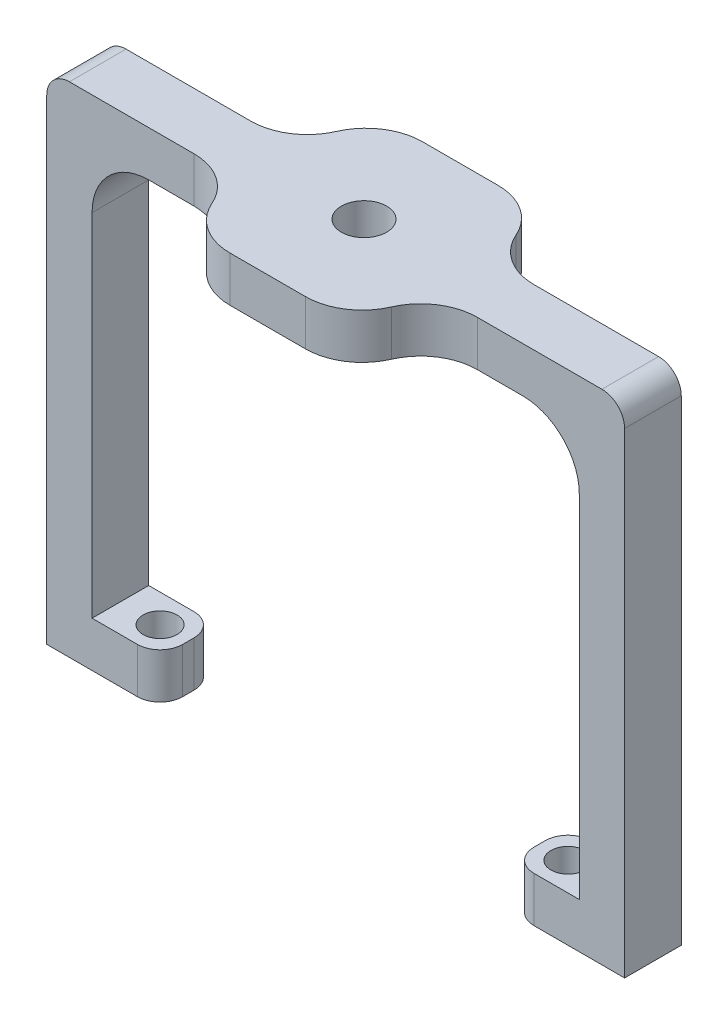
ISO-10303-21;
HEADER;
FILE_DESCRIPTION(('STEP AP214'),'2;1');
FILE_NAME('part.step','',(''),(''),'','','');
FILE_SCHEMA(('AUTOMOTIVE_DESIGN { 1 0 10303 214 1 1 1 1 }'));
ENDSEC;
DATA;
#1=APPLICATION_CONTEXT('core data for automotive mechanical design processes');
#2=APPLICATION_PROTOCOL_DEFINITION('international standard','automotive_design',2000,#1);
#3=PRODUCT_CONTEXT('',#1,'mechanical');
#4=PRODUCT('Part','Part','',(#3));
#5=PRODUCT_RELATED_PRODUCT_CATEGORY('part','',(#4));
#6=PRODUCT_DEFINITION_FORMATION('','',#4);
#7=PRODUCT_DEFINITION_CONTEXT('part definition',#1,'design');
#8=PRODUCT_DEFINITION('design','',#6,#7);
#9=PRODUCT_DEFINITION_SHAPE('','',#8);
#10=(LENGTH_UNIT() NAMED_UNIT(*) SI_UNIT(.MILLI.,.METRE.));
#11=(NAMED_UNIT(*) PLANE_ANGLE_UNIT() SI_UNIT($,.RADIAN.));
#12=(NAMED_UNIT(*) SI_UNIT($,.STERADIAN.) SOLID_ANGLE_UNIT());
#13=UNCERTAINTY_MEASURE_WITH_UNIT(LENGTH_MEASURE(1.E-05),#10,'distance_accuracy_value','');
#14=(GEOMETRIC_REPRESENTATION_CONTEXT(3) GLOBAL_UNCERTAINTY_ASSIGNED_CONTEXT((#13)) GLOBAL_UNIT_ASSIGNED_CONTEXT((#10,
#11,#12)) REPRESENTATION_CONTEXT('',''));
#15=CARTESIAN_POINT('',(0.,0.,0.));
#16=DIRECTION('',(0.,0.,1.));
#17=DIRECTION('',(1.,0.,0.));
#18=AXIS2_PLACEMENT_3D('',#15,#16,#17);
#19=CARTESIAN_POINT('',(0.,4.,5.));
#20=DIRECTION('',(0.,0.,-1.));
#21=DIRECTION('',(-1.,0.,0.));
#22=AXIS2_PLACEMENT_3D('',#19,#20,#21);
#23=PLANE('',#22);
#24=DIRECTION('',(0.,-1.,0.));
#25=VECTOR('',#24,1.);
#26=CARTESIAN_POINT('',(51.,44.,4.99999999999999));
#27=LINE('',#26,#25);
#28=CARTESIAN_POINT('',(51.,42.,4.99999999999999));
#29=VERTEX_POINT('',#28);
#30=CARTESIAN_POINT('',(51.,0.,4.99999999999999));
#31=VERTEX_POINT('',#30);
#32=EDGE_CURVE('E248',#29,#31,#27,.T.);
#33=ORIENTED_EDGE('',*,*,#32,.F.);
#34=CARTESIAN_POINT('',(49.,42.,5.));
#35=DIRECTION('',(0.,0.,-1.));
#36=DIRECTION('',(-1.,0.,0.));
#37=AXIS2_PLACEMENT_3D('',#34,#35,#36);
#38=CIRCLE('',#37,2.);
#39=CARTESIAN_POINT('',(49.,44.,5.));
#40=VERTEX_POINT('',#39);
#41=EDGE_CURVE('E443',#29,#40,#38,.F.);
#42=ORIENTED_EDGE('',*,*,#41,.T.);
#43=DIRECTION('',(1.,0.,0.));
#44=VECTOR('',#43,1.);
#45=CARTESIAN_POINT('',(0.,44.,5.));
#46=LINE('',#45,#44);
#47=CARTESIAN_POINT('',(38.,44.,5.));
#48=VERTEX_POINT('',#47);
#49=EDGE_CURVE('E291',#48,#40,#46,.T.);
#50=ORIENTED_EDGE('',*,*,#49,.F.);
#51=DIRECTION('',(0.,-1.,0.));
#52=VECTOR('',#51,1.);
#53=CARTESIAN_POINT('',(38.,4.,5.));
#54=LINE('',#53,#52);
#55=CARTESIAN_POINT('',(38.,40.,4.99999999999999));
#56=VERTEX_POINT('',#55);
#57=EDGE_CURVE('E339',#48,#56,#54,.T.);
#58=ORIENTED_EDGE('',*,*,#57,.T.);
#59=DIRECTION('',(-1.,0.,0.));
#60=VECTOR('',#59,1.);
#61=CARTESIAN_POINT('',(51.,40.,4.99999999999999));
#62=LINE('',#61,#60);
#63=CARTESIAN_POINT('',(42.,40.,4.99999999999999));
#64=VERTEX_POINT('',#63);
#65=EDGE_CURVE('E285',#64,#56,#62,.T.);
#66=ORIENTED_EDGE('',*,*,#65,.F.);
#67=CARTESIAN_POINT('',(42.,35.,5.));
#68=DIRECTION('',(0.,0.,-1.));
#69=DIRECTION('',(-1.,0.,0.));
#70=AXIS2_PLACEMENT_3D('',#67,#68,#69);
#71=CIRCLE('',#70,5.);
#72=CARTESIAN_POINT('',(47.,35.,4.99999999999999));
#73=VERTEX_POINT('',#72);
#74=EDGE_CURVE('E417',#64,#73,#71,.T.);
#75=ORIENTED_EDGE('',*,*,#74,.T.);
#76=DIRECTION('',(0.,1.,0.));
#77=VECTOR('',#76,1.);
#78=CARTESIAN_POINT('',(47.,-6.40312423743285,4.99999999999999));
#79=LINE('',#78,#77);
#80=CARTESIAN_POINT('',(47.,4.,4.99999999999999));
#81=VERTEX_POINT('',#80);
#82=EDGE_CURVE('E275',#81,#73,#79,.T.);
#83=ORIENTED_EDGE('',*,*,#82,.F.);
#84=DIRECTION('',(1.,0.,0.));
#85=VECTOR('',#84,1.);
#86=CARTESIAN_POINT('',(41.,4.,5.));
#87=LINE('',#86,#85);
#88=CARTESIAN_POINT('',(43.,4.,5.));
#89=VERTEX_POINT('',#88);
#90=EDGE_CURVE('E276',#89,#81,#87,.T.);
#91=ORIENTED_EDGE('',*,*,#90,.F.);
#92=DIRECTION('',(0.,1.,0.));
#93=VECTOR('',#92,1.);
#94=CARTESIAN_POINT('',(43.,4.,5.));
#95=LINE('',#94,#93);
#96=CARTESIAN_POINT('',(43.,0.,4.99999999999999));
#97=VERTEX_POINT('',#96);
#98=EDGE_CURVE('E250',#89,#97,#95,.F.);
#99=ORIENTED_EDGE('',*,*,#98,.T.);
#100=DIRECTION('',(1.,0.,0.));
#101=VECTOR('',#100,1.);
#102=CARTESIAN_POINT('',(51.,0.,4.99999999999999));
#103=LINE('',#102,#101);
#104=EDGE_CURVE('E246',#97,#31,#103,.T.);
#105=ORIENTED_EDGE('',*,*,#104,.T.);
#106=EDGE_LOOP('',(#33,#42,#50,#58,#66,#75,#83,#91,#99,#105));
#107=FACE_BOUND('',#106,.T.);
#108=ADVANCED_FACE('F35',(#107),#23,.F.);
#109=CARTESIAN_POINT('',(0.,4.,0.));
#110=DIRECTION('',(0.,0.,1.));
#111=DIRECTION('',(1.,0.,0.));
#112=AXIS2_PLACEMENT_3D('',#109,#110,#111);
#113=PLANE('',#112);
#114=DIRECTION('',(-1.,0.,0.));
#115=VECTOR('',#114,1.);
#116=CARTESIAN_POINT('',(0.,44.,0.));
#117=LINE('',#116,#115);
#118=CARTESIAN_POINT('',(49.,44.,0.));
#119=VERTEX_POINT('',#118);
#120=CARTESIAN_POINT('',(38.,44.,0.));
#121=VERTEX_POINT('',#120);
#122=EDGE_CURVE('E292',#119,#121,#117,.T.);
#123=ORIENTED_EDGE('',*,*,#122,.F.);
#124=CARTESIAN_POINT('',(49.,42.,0.));
#125=DIRECTION('',(0.,0.,1.));
#126=DIRECTION('',(1.,0.,0.));
#127=AXIS2_PLACEMENT_3D('',#124,#125,#126);
#128=CIRCLE('',#127,2.);
#129=CARTESIAN_POINT('',(51.,42.,0.));
#130=VERTEX_POINT('',#129);
#131=EDGE_CURVE('E452',#119,#130,#128,.F.);
#132=ORIENTED_EDGE('',*,*,#131,.T.);
#133=DIRECTION('',(0.,1.,0.));
#134=VECTOR('',#133,1.);
#135=CARTESIAN_POINT('',(51.,44.,0.));
#136=LINE('',#135,#134);
#137=CARTESIAN_POINT('',(51.,0.,0.));
#138=VERTEX_POINT('',#137);
#139=EDGE_CURVE('E264',#138,#130,#136,.T.);
#140=ORIENTED_EDGE('',*,*,#139,.F.);
#141=DIRECTION('',(-1.,0.,0.));
#142=VECTOR('',#141,1.);
#143=CARTESIAN_POINT('',(51.,0.,0.));
#144=LINE('',#143,#142);
#145=CARTESIAN_POINT('',(43.,0.,0.));
#146=VERTEX_POINT('',#145);
#147=EDGE_CURVE('E255',#138,#146,#144,.T.);
#148=ORIENTED_EDGE('',*,*,#147,.T.);
#149=DIRECTION('',(0.,-1.,0.));
#150=VECTOR('',#149,1.);
#151=CARTESIAN_POINT('',(43.,4.,0.));
#152=LINE('',#151,#150);
#153=CARTESIAN_POINT('',(43.,4.,0.));
#154=VERTEX_POINT('',#153);
#155=EDGE_CURVE('E450',#146,#154,#152,.F.);
#156=ORIENTED_EDGE('',*,*,#155,.T.);
#157=DIRECTION('',(1.,0.,0.));
#158=VECTOR('',#157,1.);
#159=CARTESIAN_POINT('',(41.,4.,0.));
#160=LINE('',#159,#158);
#161=CARTESIAN_POINT('',(47.,4.,0.));
#162=VERTEX_POINT('',#161);
#163=EDGE_CURVE('E478',#154,#162,#160,.T.);
#164=ORIENTED_EDGE('',*,*,#163,.T.);
#165=DIRECTION('',(0.,1.,0.));
#166=VECTOR('',#165,1.);
#167=CARTESIAN_POINT('',(47.,-6.40312423743285,0.));
#168=LINE('',#167,#166);
#169=CARTESIAN_POINT('',(47.,35.,0.));
#170=VERTEX_POINT('',#169);
#171=EDGE_CURVE('E272',#162,#170,#168,.T.);
#172=ORIENTED_EDGE('',*,*,#171,.T.);
#173=CARTESIAN_POINT('',(42.,35.,0.));
#174=DIRECTION('',(0.,0.,1.));
#175=DIRECTION('',(1.,0.,0.));
#176=AXIS2_PLACEMENT_3D('',#173,#174,#175);
#177=CIRCLE('',#176,5.);
#178=CARTESIAN_POINT('',(42.,40.,0.));
#179=VERTEX_POINT('',#178);
#180=EDGE_CURVE('E415',#170,#179,#177,.T.);
#181=ORIENTED_EDGE('',*,*,#180,.T.);
#182=DIRECTION('',(-1.,0.,0.));
#183=VECTOR('',#182,1.);
#184=CARTESIAN_POINT('',(51.,40.,0.));
#185=LINE('',#184,#183);
#186=CARTESIAN_POINT('',(38.,40.,0.));
#187=VERTEX_POINT('',#186);
#188=EDGE_CURVE('E282',#179,#187,#185,.T.);
#189=ORIENTED_EDGE('',*,*,#188,.T.);
#190=DIRECTION('',(0.,1.,0.));
#191=VECTOR('',#190,1.);
#192=CARTESIAN_POINT('',(38.,4.,0.));
#193=LINE('',#192,#191);
#194=EDGE_CURVE('E342',#187,#121,#193,.T.);
#195=ORIENTED_EDGE('',*,*,#194,.T.);
#196=EDGE_LOOP('',(#123,#132,#140,#148,#156,#164,#172,#181,#189,#195));
#197=FACE_BOUND('',#196,.T.);
#198=ADVANCED_FACE('F474',(#197),#113,.F.);
#199=CARTESIAN_POINT('',(47.,-6.40312423743285,4.99999999999999));
#200=DIRECTION('',(1.,0.,0.));
#201=DIRECTION('',(0.,0.,-1.));
#202=AXIS2_PLACEMENT_3D('',#199,#200,#201);
#203=PLANE('',#202);
#204=ORIENTED_EDGE('',*,*,#82,.T.);
#205=DIRECTION('',(0.,0.,-1.));
#206=VECTOR('',#205,1.);
#207=CARTESIAN_POINT('',(47.,35.,0.));
#208=LINE('',#207,#206);
#209=EDGE_CURVE('E405',#73,#170,#208,.T.);
#210=ORIENTED_EDGE('',*,*,#209,.T.);
#211=ORIENTED_EDGE('',*,*,#171,.F.);
#212=DIRECTION('',(0.,0.,-1.));
#213=VECTOR('',#212,1.);
#214=CARTESIAN_POINT('',(47.,4.,0.));
#215=LINE('',#214,#213);
#216=EDGE_CURVE('E335',#81,#162,#215,.T.);
#217=ORIENTED_EDGE('',*,*,#216,.F.);
#218=EDGE_LOOP('',(#204,#210,#211,#217));
#219=FACE_BOUND('',#218,.T.);
#220=ADVANCED_FACE('F490',(#219),#203,.F.);
#221=CARTESIAN_POINT('',(51.,40.,4.99999999999999));
#222=DIRECTION('',(0.,1.,0.));
#223=DIRECTION('',(0.,0.,1.));
#224=AXIS2_PLACEMENT_3D('',#221,#222,#223);
#225=PLANE('',#224);
#226=CARTESIAN_POINT('',(25.5,40.,2.5));
#227=DIRECTION('',(0.,1.,0.));
#228=DIRECTION('',(0.,0.,1.));
#229=AXIS2_PLACEMENT_3D('',#226,#227,#228);
#230=CIRCLE('',#229,2.);
#231=CARTESIAN_POINT('',(25.5,40.,4.5));
#232=VERTEX_POINT('',#231);
#233=EDGE_CURVE('E623',#232,#232,#230,.T.);
#234=ORIENTED_EDGE('',*,*,#233,.T.);
#235=EDGE_LOOP('',(#234));
#236=FACE_BOUND('',#235,.T.);
#237=ORIENTED_EDGE('',*,*,#188,.F.);
#238=DIRECTION('',(0.,0.,-1.));
#239=VECTOR('',#238,1.);
#240=CARTESIAN_POINT('',(42.,40.,4.99999999999999));
#241=LINE('',#240,#239);
#242=EDGE_CURVE('E411',#179,#64,#241,.F.);
#243=ORIENTED_EDGE('',*,*,#242,.T.);
#244=ORIENTED_EDGE('',*,*,#65,.T.);
#245=CARTESIAN_POINT('',(38.,40.,10.));
#246=DIRECTION('',(0.,1.,0.));
#247=DIRECTION('',(0.,0.,1.));
#248=AXIS2_PLACEMENT_3D('',#245,#246,#247);
#249=CIRCLE('',#248,5.);
#250=CARTESIAN_POINT('',(33.4174243050442,40.,8.));
#251=VERTEX_POINT('',#250);
#252=EDGE_CURVE('E353',#56,#251,#249,.T.);
#253=ORIENTED_EDGE('',*,*,#252,.T.);
#254=CARTESIAN_POINT('',(28.8348486100883,40.,6.));
#255=DIRECTION('',(0.,1.,0.));
#256=DIRECTION('',(0.,0.,1.));
#257=AXIS2_PLACEMENT_3D('',#254,#255,#256);
#258=CIRCLE('',#257,5.);
#259=CARTESIAN_POINT('',(28.8348486100883,40.,11.));
#260=VERTEX_POINT('',#259);
#261=EDGE_CURVE('E387',#251,#260,#258,.F.);
#262=ORIENTED_EDGE('',*,*,#261,.T.);
#263=DIRECTION('',(-1.,0.,0.));
#264=VECTOR('',#263,1.);
#265=CARTESIAN_POINT('',(33.,40.,11.));
#266=LINE('',#265,#264);
#267=CARTESIAN_POINT('',(22.1651513899117,40.,11.));
#268=VERTEX_POINT('',#267);
#269=EDGE_CURVE('E528',#260,#268,#266,.T.);
#270=ORIENTED_EDGE('',*,*,#269,.T.);
#271=CARTESIAN_POINT('',(22.1651513899117,40.,6.));
#272=DIRECTION('',(0.,1.,0.));
#273=DIRECTION('',(0.,0.,1.));
#274=AXIS2_PLACEMENT_3D('',#271,#272,#273);
#275=CIRCLE('',#274,5.);
#276=CARTESIAN_POINT('',(17.5825756949558,40.,8.));
#277=VERTEX_POINT('',#276);
#278=EDGE_CURVE('E385',#268,#277,#275,.F.);
#279=ORIENTED_EDGE('',*,*,#278,.T.);
#280=CARTESIAN_POINT('',(13.,40.,10.));
#281=DIRECTION('',(0.,1.,0.));
#282=DIRECTION('',(0.,0.,1.));
#283=AXIS2_PLACEMENT_3D('',#280,#281,#282);
#284=CIRCLE('',#283,5.);
#285=CARTESIAN_POINT('',(13.,40.,5.));
#286=VERTEX_POINT('',#285);
#287=EDGE_CURVE('E351',#277,#286,#284,.T.);
#288=ORIENTED_EDGE('',*,*,#287,.T.);
#289=CARTESIAN_POINT('',(9.,40.,5.));
#290=VERTEX_POINT('',#289);
#291=EDGE_CURVE('E284',#286,#290,#62,.T.);
#292=ORIENTED_EDGE('',*,*,#291,.T.);
#293=DIRECTION('',(0.,0.,-1.));
#294=VECTOR('',#293,1.);
#295=CARTESIAN_POINT('',(9.,40.,0.));
#296=LINE('',#295,#294);
#297=CARTESIAN_POINT('',(9.,40.,0.));
#298=VERTEX_POINT('',#297);
#299=EDGE_CURVE('E408',#290,#298,#296,.T.);
#300=ORIENTED_EDGE('',*,*,#299,.T.);
#301=CARTESIAN_POINT('',(13.,40.,0.));
#302=VERTEX_POINT('',#301);
#303=EDGE_CURVE('E281',#302,#298,#185,.T.);
#304=ORIENTED_EDGE('',*,*,#303,.F.);
#305=CARTESIAN_POINT('',(13.,40.,-5.));
#306=DIRECTION('',(0.,1.,0.));
#307=DIRECTION('',(0.,0.,1.));
#308=AXIS2_PLACEMENT_3D('',#305,#306,#307);
#309=CIRCLE('',#308,5.);
#310=CARTESIAN_POINT('',(17.5825756949558,40.,-3.));
#311=VERTEX_POINT('',#310);
#312=EDGE_CURVE('E364',#302,#311,#309,.T.);
#313=ORIENTED_EDGE('',*,*,#312,.T.);
#314=CARTESIAN_POINT('',(22.1651513899117,40.,-1.));
#315=DIRECTION('',(0.,1.,0.));
#316=DIRECTION('',(0.,0.,1.));
#317=AXIS2_PLACEMENT_3D('',#314,#315,#316);
#318=CIRCLE('',#317,5.);
#319=CARTESIAN_POINT('',(22.1651513899117,40.,-6.));
#320=VERTEX_POINT('',#319);
#321=EDGE_CURVE('E391',#311,#320,#318,.F.);
#322=ORIENTED_EDGE('',*,*,#321,.T.);
#323=DIRECTION('',(-1.,0.,0.));
#324=VECTOR('',#323,1.);
#325=CARTESIAN_POINT('',(33.,40.,-6.));
#326=LINE('',#325,#324);
#327=CARTESIAN_POINT('',(28.8348486100883,40.,-6.));
#328=VERTEX_POINT('',#327);
#329=EDGE_CURVE('E539',#328,#320,#326,.T.);
#330=ORIENTED_EDGE('',*,*,#329,.F.);
#331=CARTESIAN_POINT('',(28.8348486100883,40.,-1.));
#332=DIRECTION('',(0.,1.,0.));
#333=DIRECTION('',(0.,0.,1.));
#334=AXIS2_PLACEMENT_3D('',#331,#332,#333);
#335=CIRCLE('',#334,5.);
#336=CARTESIAN_POINT('',(33.4174243050442,40.,-3.));
#337=VERTEX_POINT('',#336);
#338=EDGE_CURVE('E389',#328,#337,#335,.F.);
#339=ORIENTED_EDGE('',*,*,#338,.T.);
#340=CARTESIAN_POINT('',(38.,40.,-5.));
#341=DIRECTION('',(0.,1.,0.));
#342=DIRECTION('',(0.,0.,1.));
#343=AXIS2_PLACEMENT_3D('',#340,#341,#342);
#344=CIRCLE('',#343,5.);
#345=EDGE_CURVE('E361',#337,#187,#344,.T.);
#346=ORIENTED_EDGE('',*,*,#345,.T.);
#347=EDGE_LOOP('',(#237,#243,#244,#253,#262,#270,#279,#288,#292,#300,#304,#313,#322,#330,#339,#346));
#348=FACE_BOUND('',#347,.T.);
#349=ADVANCED_FACE('F499',(#236,#348),#225,.F.);
#350=CARTESIAN_POINT('',(4.,44.,0.));
#351=DIRECTION('',(-1.,0.,0.));
#352=DIRECTION('',(0.,0.,1.));
#353=AXIS2_PLACEMENT_3D('',#350,#351,#352);
#354=PLANE('',#353);
#355=DIRECTION('',(0.,-1.,0.));
#356=VECTOR('',#355,1.);
#357=CARTESIAN_POINT('',(4.,44.,0.));
#358=LINE('',#357,#356);
#359=CARTESIAN_POINT('',(4.,35.,0.));
#360=VERTEX_POINT('',#359);
#361=CARTESIAN_POINT('',(4.,4.,0.));
#362=VERTEX_POINT('',#361);
#363=EDGE_CURVE('E294',#360,#362,#358,.T.);
#364=ORIENTED_EDGE('',*,*,#363,.F.);
#365=DIRECTION('',(0.,0.,-1.));
#366=VECTOR('',#365,1.);
#367=CARTESIAN_POINT('',(4.,35.,5.));
#368=LINE('',#367,#366);
#369=CARTESIAN_POINT('',(4.,35.,5.));
#370=VERTEX_POINT('',#369);
#371=EDGE_CURVE('E413',#360,#370,#368,.F.);
#372=ORIENTED_EDGE('',*,*,#371,.T.);
#373=DIRECTION('',(0.,-1.,0.));
#374=VECTOR('',#373,1.);
#375=CARTESIAN_POINT('',(4.,44.,5.));
#376=LINE('',#375,#374);
#377=CARTESIAN_POINT('',(4.,4.,5.));
#378=VERTEX_POINT('',#377);
#379=EDGE_CURVE('E299',#370,#378,#376,.T.);
#380=ORIENTED_EDGE('',*,*,#379,.T.);
#381=DIRECTION('',(0.,0.,-1.));
#382=VECTOR('',#381,1.);
#383=CARTESIAN_POINT('',(4.,4.,0.));
#384=LINE('',#383,#382);
#385=EDGE_CURVE('E287',#378,#362,#384,.T.);
#386=ORIENTED_EDGE('',*,*,#385,.T.);
#387=EDGE_LOOP('',(#364,#372,#380,#386));
#388=FACE_BOUND('',#387,.T.);
#389=ADVANCED_FACE('F577',(#388),#354,.F.);
#390=CARTESIAN_POINT('',(0.,4.,0.));
#391=DIRECTION('',(1.,0.,0.));
#392=DIRECTION('',(0.,0.,-1.));
#393=AXIS2_PLACEMENT_3D('',#390,#391,#392);
#394=PLANE('',#393);
#395=DIRECTION('',(0.,-1.,0.));
#396=VECTOR('',#395,1.);
#397=CARTESIAN_POINT('',(0.,4.,5.));
#398=LINE('',#397,#396);
#399=CARTESIAN_POINT('',(0.,42.,5.));
#400=VERTEX_POINT('',#399);
#401=CARTESIAN_POINT('',(0.,0.,5.));
#402=VERTEX_POINT('',#401);
#403=EDGE_CURVE('E329',#400,#402,#398,.T.);
#404=ORIENTED_EDGE('',*,*,#403,.F.);
#405=DIRECTION('',(0.,0.,1.));
#406=VECTOR('',#405,1.);
#407=CARTESIAN_POINT('',(0.,42.,0.));
#408=LINE('',#407,#406);
#409=CARTESIAN_POINT('',(0.,42.,0.));
#410=VERTEX_POINT('',#409);
#411=EDGE_CURVE('E456',#400,#410,#408,.F.);
#412=ORIENTED_EDGE('',*,*,#411,.T.);
#413=DIRECTION('',(0.,-1.,0.));
#414=VECTOR('',#413,1.);
#415=CARTESIAN_POINT('',(0.,4.,0.));
#416=LINE('',#415,#414);
#417=CARTESIAN_POINT('',(0.,0.,0.));
#418=VERTEX_POINT('',#417);
#419=EDGE_CURVE('E317',#410,#418,#416,.T.);
#420=ORIENTED_EDGE('',*,*,#419,.T.);
#421=DIRECTION('',(0.,0.,1.));
#422=VECTOR('',#421,1.);
#423=CARTESIAN_POINT('',(0.,0.,0.));
#424=LINE('',#423,#422);
#425=EDGE_CURVE('E305',#418,#402,#424,.T.);
#426=ORIENTED_EDGE('',*,*,#425,.T.);
#427=EDGE_LOOP('',(#404,#412,#420,#426));
#428=FACE_BOUND('',#427,.T.);
#429=ADVANCED_FACE('F570',(#428),#394,.F.);
#430=CARTESIAN_POINT('',(2.,44.,5.));
#431=VERTEX_POINT('',#430);
#432=CARTESIAN_POINT('',(13.,44.,5.));
#433=VERTEX_POINT('',#432);
#434=EDGE_CURVE('E288',#431,#433,#46,.T.);
#435=ORIENTED_EDGE('',*,*,#434,.F.);
#436=CARTESIAN_POINT('',(2.,42.,5.));
#437=DIRECTION('',(0.,0.,-1.));
#438=DIRECTION('',(-1.,0.,0.));
#439=AXIS2_PLACEMENT_3D('',#436,#437,#438);
#440=CIRCLE('',#439,2.);
#441=EDGE_CURVE('E454',#431,#400,#440,.F.);
#442=ORIENTED_EDGE('',*,*,#441,.T.);
#443=ORIENTED_EDGE('',*,*,#403,.T.);
#444=DIRECTION('',(1.,0.,0.));
#445=VECTOR('',#444,1.);
#446=CARTESIAN_POINT('',(0.,0.,5.));
#447=LINE('',#446,#445);
#448=CARTESIAN_POINT('',(8.,0.,5.));
#449=VERTEX_POINT('',#448);
#450=EDGE_CURVE('E320',#402,#449,#447,.T.);
#451=ORIENTED_EDGE('',*,*,#450,.T.);
#452=DIRECTION('',(0.,-1.,0.));
#453=VECTOR('',#452,1.);
#454=CARTESIAN_POINT('',(8.,4.,5.));
#455=LINE('',#454,#453);
#456=CARTESIAN_POINT('',(8.,4.,5.));
#457=VERTEX_POINT('',#456);
#458=EDGE_CURVE('E439',#449,#457,#455,.F.);
#459=ORIENTED_EDGE('',*,*,#458,.T.);
#460=DIRECTION('',(1.,0.,0.));
#461=VECTOR('',#460,1.);
#462=CARTESIAN_POINT('',(0.,4.,5.));
#463=LINE('',#462,#461);
#464=EDGE_CURVE('E308',#378,#457,#463,.T.);
#465=ORIENTED_EDGE('',*,*,#464,.F.);
#466=ORIENTED_EDGE('',*,*,#379,.F.);
#467=CARTESIAN_POINT('',(9.,35.,5.));
#468=DIRECTION('',(0.,0.,-1.));
#469=DIRECTION('',(-1.,0.,0.));
#470=AXIS2_PLACEMENT_3D('',#467,#468,#469);
#471=CIRCLE('',#470,5.);
#472=EDGE_CURVE('E421',#370,#290,#471,.T.);
#473=ORIENTED_EDGE('',*,*,#472,.T.);
#474=ORIENTED_EDGE('',*,*,#291,.F.);
#475=DIRECTION('',(0.,1.,0.));
#476=VECTOR('',#475,1.);
#477=CARTESIAN_POINT('',(13.,4.,5.));
#478=LINE('',#477,#476);
#479=EDGE_CURVE('E331',#286,#433,#478,.T.);
#480=ORIENTED_EDGE('',*,*,#479,.T.);
#481=EDGE_LOOP('',(#435,#442,#443,#451,#459,#465,#466,#473,#474,#480));
#482=FACE_BOUND('',#481,.T.);
#483=ADVANCED_FACE('F560',(#482),#23,.F.);
#484=CARTESIAN_POINT('',(10.,4.,0.));
#485=DIRECTION('',(-1.,0.,0.));
#486=DIRECTION('',(0.,0.,1.));
#487=AXIS2_PLACEMENT_3D('',#484,#485,#486);
#488=PLANE('',#487);
#489=DIRECTION('',(0.,0.,-1.));
#490=VECTOR('',#489,1.);
#491=CARTESIAN_POINT('',(10.,0.,0.));
#492=LINE('',#491,#490);
#493=CARTESIAN_POINT('',(10.,0.,3.));
#494=VERTEX_POINT('',#493);
#495=CARTESIAN_POINT('',(10.,0.,2.));
#496=VERTEX_POINT('',#495);
#497=EDGE_CURVE('E323',#494,#496,#492,.T.);
#498=ORIENTED_EDGE('',*,*,#497,.T.);
#499=DIRECTION('',(0.,-1.,0.));
#500=VECTOR('',#499,1.);
#501=CARTESIAN_POINT('',(10.,4.,2.));
#502=LINE('',#501,#500);
#503=CARTESIAN_POINT('',(10.,4.,2.));
#504=VERTEX_POINT('',#503);
#505=EDGE_CURVE('E433',#496,#504,#502,.F.);
#506=ORIENTED_EDGE('',*,*,#505,.T.);
#507=DIRECTION('',(0.,0.,-1.));
#508=VECTOR('',#507,1.);
#509=CARTESIAN_POINT('',(10.,4.,0.));
#510=LINE('',#509,#508);
#511=CARTESIAN_POINT('',(10.,4.,3.));
#512=VERTEX_POINT('',#511);
#513=EDGE_CURVE('E311',#512,#504,#510,.T.);
#514=ORIENTED_EDGE('',*,*,#513,.F.);
#515=DIRECTION('',(0.,-1.,0.));
#516=VECTOR('',#515,1.);
#517=CARTESIAN_POINT('',(10.,4.,3.));
#518=LINE('',#517,#516);
#519=EDGE_CURVE('E430',#512,#494,#518,.T.);
#520=ORIENTED_EDGE('',*,*,#519,.T.);
#521=EDGE_LOOP('',(#498,#506,#514,#520));
#522=FACE_BOUND('',#521,.T.);
#523=ADVANCED_FACE('F569',(#522),#488,.F.);
#524=ORIENTED_EDGE('',*,*,#419,.F.);
#525=CARTESIAN_POINT('',(2.,42.,0.));
#526=DIRECTION('',(0.,0.,1.));
#527=DIRECTION('',(1.,0.,0.));
#528=AXIS2_PLACEMENT_3D('',#525,#526,#527);
#529=CIRCLE('',#528,2.);
#530=CARTESIAN_POINT('',(2.,44.,0.));
#531=VERTEX_POINT('',#530);
#532=EDGE_CURVE('E458',#410,#531,#529,.F.);
#533=ORIENTED_EDGE('',*,*,#532,.T.);
#534=CARTESIAN_POINT('',(13.,44.,0.));
#535=VERTEX_POINT('',#534);
#536=EDGE_CURVE('E290',#535,#531,#117,.T.);
#537=ORIENTED_EDGE('',*,*,#536,.F.);
#538=DIRECTION('',(0.,-1.,0.));
#539=VECTOR('',#538,1.);
#540=CARTESIAN_POINT('',(13.,4.,0.));
#541=LINE('',#540,#539);
#542=EDGE_CURVE('E345',#535,#302,#541,.T.);
#543=ORIENTED_EDGE('',*,*,#542,.T.);
#544=ORIENTED_EDGE('',*,*,#303,.T.);
#545=CARTESIAN_POINT('',(9.,35.,0.));
#546=DIRECTION('',(0.,0.,1.));
#547=DIRECTION('',(1.,0.,0.));
#548=AXIS2_PLACEMENT_3D('',#545,#546,#547);
#549=CIRCLE('',#548,5.);
#550=EDGE_CURVE('E419',#298,#360,#549,.T.);
#551=ORIENTED_EDGE('',*,*,#550,.T.);
#552=ORIENTED_EDGE('',*,*,#363,.T.);
#553=DIRECTION('',(-1.,0.,0.));
#554=VECTOR('',#553,1.);
#555=CARTESIAN_POINT('',(0.,4.,0.));
#556=LINE('',#555,#554);
#557=CARTESIAN_POINT('',(8.,4.,0.));
#558=VERTEX_POINT('',#557);
#559=EDGE_CURVE('E315',#558,#362,#556,.T.);
#560=ORIENTED_EDGE('',*,*,#559,.F.);
#561=DIRECTION('',(0.,-1.,0.));
#562=VECTOR('',#561,1.);
#563=CARTESIAN_POINT('',(8.,4.,0.));
#564=LINE('',#563,#562);
#565=CARTESIAN_POINT('',(8.,0.,0.));
#566=VERTEX_POINT('',#565);
#567=EDGE_CURVE('E423',#558,#566,#564,.T.);
#568=ORIENTED_EDGE('',*,*,#567,.T.);
#569=DIRECTION('',(-1.,0.,0.));
#570=VECTOR('',#569,1.);
#571=CARTESIAN_POINT('',(0.,0.,0.));
#572=LINE('',#571,#570);
#573=EDGE_CURVE('E312',#566,#418,#572,.T.);
#574=ORIENTED_EDGE('',*,*,#573,.T.);
#575=EDGE_LOOP('',(#524,#533,#537,#543,#544,#551,#552,#560,#568,#574));
#576=FACE_BOUND('',#575,.T.);
#577=ADVANCED_FACE('F565',(#576),#113,.F.);
#578=CARTESIAN_POINT('',(0.,4.,0.));
#579=DIRECTION('',(0.,1.,0.));
#580=DIRECTION('',(0.,0.,1.));
#581=AXIS2_PLACEMENT_3D('',#578,#579,#580);
#582=PLANE('',#581);
#583=ORIENTED_EDGE('',*,*,#513,.T.);
#584=CARTESIAN_POINT('',(8.,4.,2.));
#585=DIRECTION('',(0.,1.,0.));
#586=DIRECTION('',(0.,0.,1.));
#587=AXIS2_PLACEMENT_3D('',#584,#585,#586);
#588=CIRCLE('',#587,2.);
#589=EDGE_CURVE('E437',#504,#558,#588,.T.);
#590=ORIENTED_EDGE('',*,*,#589,.T.);
#591=ORIENTED_EDGE('',*,*,#559,.T.);
#592=ORIENTED_EDGE('',*,*,#385,.F.);
#593=ORIENTED_EDGE('',*,*,#464,.T.);
#594=CARTESIAN_POINT('',(8.,4.,3.));
#595=DIRECTION('',(0.,1.,0.));
#596=DIRECTION('',(0.,0.,1.));
#597=AXIS2_PLACEMENT_3D('',#594,#595,#596);
#598=CIRCLE('',#597,2.);
#599=EDGE_CURVE('E435',#457,#512,#598,.T.);
#600=ORIENTED_EDGE('',*,*,#599,.T.);
#601=EDGE_LOOP('',(#583,#590,#591,#592,#593,#600));
#602=FACE_BOUND('',#601,.T.);
#603=CARTESIAN_POINT('',(7.5,4.,2.5));
#604=DIRECTION('',(0.,1.,0.));
#605=DIRECTION('',(0.,0.,1.));
#606=AXIS2_PLACEMENT_3D('',#603,#604,#605);
#607=CIRCLE('',#606,1.5);
#608=CARTESIAN_POINT('',(7.5,4.,4.));
#609=VERTEX_POINT('',#608);
#610=EDGE_CURVE('E301',#609,#609,#607,.T.);
#611=ORIENTED_EDGE('',*,*,#610,.F.);
#612=EDGE_LOOP('',(#611));
#613=FACE_BOUND('',#612,.T.);
#614=ADVANCED_FACE('F648',(#602,#613),#582,.T.);
#615=CARTESIAN_POINT('',(0.,0.,0.));
#616=DIRECTION('',(0.,1.,0.));
#617=DIRECTION('',(0.,0.,1.));
#618=AXIS2_PLACEMENT_3D('',#615,#616,#617);
#619=PLANE('',#618);
#620=CARTESIAN_POINT('',(7.5,0.,2.5));
#621=DIRECTION('',(0.,1.,0.));
#622=DIRECTION('',(0.,0.,1.));
#623=AXIS2_PLACEMENT_3D('',#620,#621,#622);
#624=CIRCLE('',#623,1.5);
#625=CARTESIAN_POINT('',(7.5,0.,4.));
#626=VERTEX_POINT('',#625);
#627=EDGE_CURVE('E302',#626,#626,#624,.T.);
#628=ORIENTED_EDGE('',*,*,#627,.T.);
#629=EDGE_LOOP('',(#628));
#630=FACE_BOUND('',#629,.T.);
#631=ORIENTED_EDGE('',*,*,#573,.F.);
#632=CARTESIAN_POINT('',(8.,0.,2.));
#633=DIRECTION('',(0.,1.,0.));
#634=DIRECTION('',(0.,0.,1.));
#635=AXIS2_PLACEMENT_3D('',#632,#633,#634);
#636=CIRCLE('',#635,2.);
#637=EDGE_CURVE('E428',#566,#496,#636,.F.);
#638=ORIENTED_EDGE('',*,*,#637,.T.);
#639=ORIENTED_EDGE('',*,*,#497,.F.);
#640=CARTESIAN_POINT('',(8.,0.,3.));
#641=DIRECTION('',(0.,1.,0.));
#642=DIRECTION('',(0.,0.,1.));
#643=AXIS2_PLACEMENT_3D('',#640,#641,#642);
#644=CIRCLE('',#643,2.);
#645=EDGE_CURVE('E426',#494,#449,#644,.F.);
#646=ORIENTED_EDGE('',*,*,#645,.T.);
#647=ORIENTED_EDGE('',*,*,#450,.F.);
#648=ORIENTED_EDGE('',*,*,#425,.F.);
#649=EDGE_LOOP('',(#631,#638,#639,#646,#647,#648));
#650=FACE_BOUND('',#649,.T.);
#651=ADVANCED_FACE('F640',(#630,#650),#619,.F.);
#652=CARTESIAN_POINT('',(7.5,0.,2.5));
#653=DIRECTION('',(0.,1.,0.));
#654=DIRECTION('',(0.,0.,1.));
#655=AXIS2_PLACEMENT_3D('',#652,#653,#654);
#656=CYLINDRICAL_SURFACE('',#655,1.5);
#657=ORIENTED_EDGE('',*,*,#627,.F.);
#658=EDGE_LOOP('',(#657));
#659=FACE_BOUND('',#658,.T.);
#660=ORIENTED_EDGE('',*,*,#610,.T.);
#661=EDGE_LOOP('',(#660));
#662=FACE_BOUND('',#661,.T.);
#663=ADVANCED_FACE('F635',(#659,#662),#656,.F.);
#664=CARTESIAN_POINT('',(0.,44.,0.));
#665=DIRECTION('',(0.,1.,0.));
#666=DIRECTION('',(0.,0.,1.));
#667=AXIS2_PLACEMENT_3D('',#664,#665,#666);
#668=PLANE('',#667);
#669=CARTESIAN_POINT('',(25.5,44.,2.5));
#670=DIRECTION('',(0.,1.,0.));
#671=DIRECTION('',(0.,0.,1.));
#672=AXIS2_PLACEMENT_3D('',#669,#670,#671);
#673=CIRCLE('',#672,2.);
#674=CARTESIAN_POINT('',(25.5,44.,4.5));
#675=VERTEX_POINT('',#674);
#676=EDGE_CURVE('E625',#675,#675,#673,.T.);
#677=ORIENTED_EDGE('',*,*,#676,.F.);
#678=EDGE_LOOP('',(#677));
#679=FACE_BOUND('',#678,.T.);
#680=ORIENTED_EDGE('',*,*,#49,.T.);
#681=DIRECTION('',(0.,0.,1.));
#682=VECTOR('',#681,1.);
#683=CARTESIAN_POINT('',(49.,44.,0.));
#684=LINE('',#683,#682);
#685=EDGE_CURVE('E448',#40,#119,#684,.F.);
#686=ORIENTED_EDGE('',*,*,#685,.T.);
#687=ORIENTED_EDGE('',*,*,#122,.T.);
#688=CARTESIAN_POINT('',(38.,44.,-5.));
#689=DIRECTION('',(0.,1.,0.));
#690=DIRECTION('',(0.,0.,1.));
#691=AXIS2_PLACEMENT_3D('',#688,#689,#690);
#692=CIRCLE('',#691,5.);
#693=CARTESIAN_POINT('',(33.4174243050442,44.,-3.));
#694=VERTEX_POINT('',#693);
#695=EDGE_CURVE('E358',#121,#694,#692,.F.);
#696=ORIENTED_EDGE('',*,*,#695,.T.);
#697=CARTESIAN_POINT('',(28.8348486100883,44.,-1.));
#698=DIRECTION('',(0.,1.,0.));
#699=DIRECTION('',(0.,0.,1.));
#700=AXIS2_PLACEMENT_3D('',#697,#698,#699);
#701=CIRCLE('',#700,5.);
#702=CARTESIAN_POINT('',(28.8348486100883,44.,-6.));
#703=VERTEX_POINT('',#702);
#704=EDGE_CURVE('E379',#694,#703,#701,.T.);
#705=ORIENTED_EDGE('',*,*,#704,.T.);
#706=DIRECTION('',(1.,0.,0.));
#707=VECTOR('',#706,1.);
#708=CARTESIAN_POINT('',(33.,44.,-6.));
#709=LINE('',#708,#707);
#710=CARTESIAN_POINT('',(22.1651513899117,44.,-6.));
#711=VERTEX_POINT('',#710);
#712=EDGE_CURVE('E535',#711,#703,#709,.T.);
#713=ORIENTED_EDGE('',*,*,#712,.F.);
#714=CARTESIAN_POINT('',(22.1651513899117,44.,-1.));
#715=DIRECTION('',(0.,1.,0.));
#716=DIRECTION('',(0.,0.,1.));
#717=AXIS2_PLACEMENT_3D('',#714,#715,#716);
#718=CIRCLE('',#717,5.);
#719=CARTESIAN_POINT('',(17.5825756949558,44.,-3.));
#720=VERTEX_POINT('',#719);
#721=EDGE_CURVE('E381',#711,#720,#718,.T.);
#722=ORIENTED_EDGE('',*,*,#721,.T.);
#723=CARTESIAN_POINT('',(13.,44.,-5.));
#724=DIRECTION('',(0.,1.,0.));
#725=DIRECTION('',(0.,0.,1.));
#726=AXIS2_PLACEMENT_3D('',#723,#724,#725);
#727=CIRCLE('',#726,5.);
#728=EDGE_CURVE('E367',#720,#535,#727,.F.);
#729=ORIENTED_EDGE('',*,*,#728,.T.);
#730=ORIENTED_EDGE('',*,*,#536,.T.);
#731=DIRECTION('',(0.,0.,1.));
#732=VECTOR('',#731,1.);
#733=CARTESIAN_POINT('',(2.,44.,5.));
#734=LINE('',#733,#732);
#735=EDGE_CURVE('E445',#531,#431,#734,.T.);
#736=ORIENTED_EDGE('',*,*,#735,.T.);
#737=ORIENTED_EDGE('',*,*,#434,.T.);
#738=CARTESIAN_POINT('',(13.,44.,10.));
#739=DIRECTION('',(0.,1.,0.));
#740=DIRECTION('',(0.,0.,1.));
#741=AXIS2_PLACEMENT_3D('',#738,#739,#740);
#742=CIRCLE('',#741,5.);
#743=CARTESIAN_POINT('',(17.5825756949558,44.,8.));
#744=VERTEX_POINT('',#743);
#745=EDGE_CURVE('E348',#433,#744,#742,.F.);
#746=ORIENTED_EDGE('',*,*,#745,.T.);
#747=CARTESIAN_POINT('',(22.1651513899117,44.,6.));
#748=DIRECTION('',(0.,1.,0.));
#749=DIRECTION('',(0.,0.,1.));
#750=AXIS2_PLACEMENT_3D('',#747,#748,#749);
#751=CIRCLE('',#750,5.);
#752=CARTESIAN_POINT('',(22.1651513899117,44.,11.));
#753=VERTEX_POINT('',#752);
#754=EDGE_CURVE('E375',#744,#753,#751,.T.);
#755=ORIENTED_EDGE('',*,*,#754,.T.);
#756=DIRECTION('',(1.,0.,0.));
#757=VECTOR('',#756,1.);
#758=CARTESIAN_POINT('',(33.,44.,11.));
#759=LINE('',#758,#757);
#760=CARTESIAN_POINT('',(28.8348486100883,44.,11.));
#761=VERTEX_POINT('',#760);
#762=EDGE_CURVE('E534',#753,#761,#759,.T.);
#763=ORIENTED_EDGE('',*,*,#762,.T.);
#764=CARTESIAN_POINT('',(28.8348486100883,44.,6.));
#765=DIRECTION('',(0.,1.,0.));
#766=DIRECTION('',(0.,0.,1.));
#767=AXIS2_PLACEMENT_3D('',#764,#765,#766);
#768=CIRCLE('',#767,5.);
#769=CARTESIAN_POINT('',(33.4174243050442,44.,8.));
#770=VERTEX_POINT('',#769);
#771=EDGE_CURVE('E377',#761,#770,#768,.T.);
#772=ORIENTED_EDGE('',*,*,#771,.T.);
#773=CARTESIAN_POINT('',(38.,44.,10.));
#774=DIRECTION('',(0.,1.,0.));
#775=DIRECTION('',(0.,0.,1.));
#776=AXIS2_PLACEMENT_3D('',#773,#774,#775);
#777=CIRCLE('',#776,5.);
#778=EDGE_CURVE('E356',#770,#48,#777,.F.);
#779=ORIENTED_EDGE('',*,*,#778,.T.);
#780=EDGE_LOOP('',(#680,#686,#687,#696,#705,#713,#722,#729,#730,#736,#737,#746,#755,#763,#772,#779));
#781=FACE_BOUND('',#780,.T.);
#782=ADVANCED_FACE('F515',(#679,#781),#668,.T.);
#783=CARTESIAN_POINT('',(51.,0.,0.));
#784=DIRECTION('',(1.,0.,0.));
#785=DIRECTION('',(0.,0.,-1.));
#786=AXIS2_PLACEMENT_3D('',#783,#784,#785);
#787=PLANE('',#786);
#788=ORIENTED_EDGE('',*,*,#139,.T.);
#789=DIRECTION('',(0.,0.,1.));
#790=VECTOR('',#789,1.);
#791=CARTESIAN_POINT('',(51.,42.,0.));
#792=LINE('',#791,#790);
#793=EDGE_CURVE('E263',#130,#29,#792,.T.);
#794=ORIENTED_EDGE('',*,*,#793,.T.);
#795=ORIENTED_EDGE('',*,*,#32,.T.);
#796=DIRECTION('',(0.,0.,-1.));
#797=VECTOR('',#796,1.);
#798=CARTESIAN_POINT('',(51.,0.,4.99999999999999));
#799=LINE('',#798,#797);
#800=EDGE_CURVE('E254',#31,#138,#799,.T.);
#801=ORIENTED_EDGE('',*,*,#800,.T.);
#802=EDGE_LOOP('',(#788,#794,#795,#801));
#803=FACE_BOUND('',#802,.T.);
#804=ADVANCED_FACE('F261',(#803),#787,.T.);
#805=CARTESIAN_POINT('',(0.,0.,0.));
#806=DIRECTION('',(0.,1.,0.));
#807=DIRECTION('',(0.,0.,1.));
#808=AXIS2_PLACEMENT_3D('',#805,#806,#807);
#809=PLANE('',#808);
#810=CARTESIAN_POINT('',(43.5,0.,2.5));
#811=DIRECTION('',(0.,-1.,0.));
#812=DIRECTION('',(0.,0.,-1.));
#813=AXIS2_PLACEMENT_3D('',#810,#811,#812);
#814=CIRCLE('',#813,1.5);
#815=CARTESIAN_POINT('',(43.5,0.,0.999999999999997));
#816=VERTEX_POINT('',#815);
#817=EDGE_CURVE('E336',#816,#816,#814,.T.);
#818=ORIENTED_EDGE('',*,*,#817,.F.);
#819=EDGE_LOOP('',(#818));
#820=FACE_BOUND('',#819,.T.);
#821=ORIENTED_EDGE('',*,*,#104,.F.);
#822=CARTESIAN_POINT('',(43.,0.,3.));
#823=DIRECTION('',(0.,1.,0.));
#824=DIRECTION('',(0.,0.,1.));
#825=AXIS2_PLACEMENT_3D('',#822,#823,#824);
#826=CIRCLE('',#825,2.);
#827=CARTESIAN_POINT('',(41.,0.,3.));
#828=VERTEX_POINT('',#827);
#829=EDGE_CURVE('E11',#97,#828,#826,.F.);
#830=ORIENTED_EDGE('',*,*,#829,.T.);
#831=DIRECTION('',(0.,0.,1.));
#832=VECTOR('',#831,1.);
#833=CARTESIAN_POINT('',(41.,0.,0.));
#834=LINE('',#833,#832);
#835=CARTESIAN_POINT('',(41.,0.,2.));
#836=VERTEX_POINT('',#835);
#837=EDGE_CURVE('E468',#836,#828,#834,.T.);
#838=ORIENTED_EDGE('',*,*,#837,.F.);
#839=CARTESIAN_POINT('',(43.,0.,2.));
#840=DIRECTION('',(0.,1.,0.));
#841=DIRECTION('',(0.,0.,1.));
#842=AXIS2_PLACEMENT_3D('',#839,#840,#841);
#843=CIRCLE('',#842,2.);
#844=EDGE_CURVE('E43',#836,#146,#843,.F.);
#845=ORIENTED_EDGE('',*,*,#844,.T.);
#846=ORIENTED_EDGE('',*,*,#147,.F.);
#847=ORIENTED_EDGE('',*,*,#800,.F.);
#848=EDGE_LOOP('',(#821,#830,#838,#845,#846,#847));
#849=FACE_BOUND('',#848,.T.);
#850=ADVANCED_FACE('F267',(#820,#849),#809,.F.);
#851=CARTESIAN_POINT('',(41.,4.,0.));
#852=DIRECTION('',(0.,-1.,0.));
#853=DIRECTION('',(0.,0.,-1.));
#854=AXIS2_PLACEMENT_3D('',#851,#852,#853);
#855=PLANE('',#854);
#856=CARTESIAN_POINT('',(43.5,4.,2.5));
#857=DIRECTION('',(0.,-1.,0.));
#858=DIRECTION('',(0.,0.,-1.));
#859=AXIS2_PLACEMENT_3D('',#856,#857,#858);
#860=CIRCLE('',#859,1.5);
#861=CARTESIAN_POINT('',(43.5,4.,0.999999999999997));
#862=VERTEX_POINT('',#861);
#863=EDGE_CURVE('E332',#862,#862,#860,.T.);
#864=ORIENTED_EDGE('',*,*,#863,.T.);
#865=EDGE_LOOP('',(#864));
#866=FACE_BOUND('',#865,.T.);
#867=DIRECTION('',(0.,0.,-1.));
#868=VECTOR('',#867,1.);
#869=CARTESIAN_POINT('',(41.,4.,0.));
#870=LINE('',#869,#868);
#871=CARTESIAN_POINT('',(41.,4.,3.));
#872=VERTEX_POINT('',#871);
#873=CARTESIAN_POINT('',(41.,4.,2.));
#874=VERTEX_POINT('',#873);
#875=EDGE_CURVE('E477',#872,#874,#870,.T.);
#876=ORIENTED_EDGE('',*,*,#875,.F.);
#877=CARTESIAN_POINT('',(43.,4.,3.));
#878=DIRECTION('',(0.,-1.,0.));
#879=DIRECTION('',(0.,0.,-1.));
#880=AXIS2_PLACEMENT_3D('',#877,#878,#879);
#881=CIRCLE('',#880,2.);
#882=EDGE_CURVE('E58',#872,#89,#881,.F.);
#883=ORIENTED_EDGE('',*,*,#882,.T.);
#884=ORIENTED_EDGE('',*,*,#90,.T.);
#885=ORIENTED_EDGE('',*,*,#216,.T.);
#886=ORIENTED_EDGE('',*,*,#163,.F.);
#887=CARTESIAN_POINT('',(43.,4.,2.));
#888=DIRECTION('',(0.,-1.,0.));
#889=DIRECTION('',(0.,0.,-1.));
#890=AXIS2_PLACEMENT_3D('',#887,#888,#889);
#891=CIRCLE('',#890,2.);
#892=EDGE_CURVE('E50',#154,#874,#891,.F.);
#893=ORIENTED_EDGE('',*,*,#892,.T.);
#894=EDGE_LOOP('',(#876,#883,#884,#885,#886,#893));
#895=FACE_BOUND('',#894,.T.);
#896=ADVANCED_FACE('F486',(#866,#895),#855,.F.);
#897=CARTESIAN_POINT('',(41.,0.,0.));
#898=DIRECTION('',(1.,0.,0.));
#899=DIRECTION('',(0.,0.,-1.));
#900=AXIS2_PLACEMENT_3D('',#897,#898,#899);
#901=PLANE('',#900);
#902=ORIENTED_EDGE('',*,*,#837,.T.);
#903=DIRECTION('',(0.,1.,0.));
#904=VECTOR('',#903,1.);
#905=CARTESIAN_POINT('',(41.,0.,3.));
#906=LINE('',#905,#904);
#907=EDGE_CURVE('E463',#828,#872,#906,.T.);
#908=ORIENTED_EDGE('',*,*,#907,.T.);
#909=ORIENTED_EDGE('',*,*,#875,.T.);
#910=DIRECTION('',(0.,-1.,0.));
#911=VECTOR('',#910,1.);
#912=CARTESIAN_POINT('',(41.,0.,2.));
#913=LINE('',#912,#911);
#914=EDGE_CURVE('E460',#874,#836,#913,.T.);
#915=ORIENTED_EDGE('',*,*,#914,.T.);
#916=EDGE_LOOP('',(#902,#908,#909,#915));
#917=FACE_BOUND('',#916,.T.);
#918=ADVANCED_FACE('F476',(#917),#901,.F.);
#919=CARTESIAN_POINT('',(43.5,6.,2.5));
#920=DIRECTION('',(0.,-1.,0.));
#921=DIRECTION('',(0.,0.,-1.));
#922=AXIS2_PLACEMENT_3D('',#919,#920,#921);
#923=CYLINDRICAL_SURFACE('',#922,1.5);
#924=ORIENTED_EDGE('',*,*,#817,.T.);
#925=EDGE_LOOP('',(#924));
#926=FACE_BOUND('',#925,.T.);
#927=ORIENTED_EDGE('',*,*,#863,.F.);
#928=EDGE_LOOP('',(#927));
#929=FACE_BOUND('',#928,.T.);
#930=ADVANCED_FACE('F545',(#926,#929),#923,.F.);
#931=CARTESIAN_POINT('',(0.,0.,-6.));
#932=DIRECTION('',(0.,0.,-1.));
#933=DIRECTION('',(-1.,0.,0.));
#934=AXIS2_PLACEMENT_3D('',#931,#932,#933);
#935=PLANE('',#934);
#936=ORIENTED_EDGE('',*,*,#329,.T.);
#937=DIRECTION('',(0.,1.,0.));
#938=VECTOR('',#937,1.);
#939=CARTESIAN_POINT('',(22.1651513899117,44.,-6.));
#940=LINE('',#939,#938);
#941=EDGE_CURVE('E372',#320,#711,#940,.T.);
#942=ORIENTED_EDGE('',*,*,#941,.T.);
#943=ORIENTED_EDGE('',*,*,#712,.T.);
#944=DIRECTION('',(0.,-1.,0.));
#945=VECTOR('',#944,1.);
#946=CARTESIAN_POINT('',(28.8348486100883,40.,-6.));
#947=LINE('',#946,#945);
#948=EDGE_CURVE('E369',#703,#328,#947,.T.);
#949=ORIENTED_EDGE('',*,*,#948,.T.);
#950=EDGE_LOOP('',(#936,#942,#943,#949));
#951=FACE_BOUND('',#950,.T.);
#952=ADVANCED_FACE('F618',(#951),#935,.T.);
#953=CARTESIAN_POINT('',(0.,0.,11.));
#954=DIRECTION('',(0.,0.,-1.));
#955=DIRECTION('',(-1.,0.,0.));
#956=AXIS2_PLACEMENT_3D('',#953,#954,#955);
#957=PLANE('',#956);
#958=ORIENTED_EDGE('',*,*,#269,.F.);
#959=DIRECTION('',(0.,-1.,0.));
#960=VECTOR('',#959,1.);
#961=CARTESIAN_POINT('',(28.8348486100883,0.,11.));
#962=LINE('',#961,#960);
#963=EDGE_CURVE('E400',#260,#761,#962,.F.);
#964=ORIENTED_EDGE('',*,*,#963,.T.);
#965=ORIENTED_EDGE('',*,*,#762,.F.);
#966=DIRECTION('',(0.,1.,0.));
#967=VECTOR('',#966,1.);
#968=CARTESIAN_POINT('',(22.1651513899117,0.,11.));
#969=LINE('',#968,#967);
#970=EDGE_CURVE('E398',#753,#268,#969,.F.);
#971=ORIENTED_EDGE('',*,*,#970,.T.);
#972=EDGE_LOOP('',(#958,#964,#965,#971));
#973=FACE_BOUND('',#972,.T.);
#974=ADVANCED_FACE('F531',(#973),#957,.F.);
#975=CARTESIAN_POINT('',(13.,4.,10.));
#976=DIRECTION('',(0.,1.,0.));
#977=DIRECTION('',(0.,0.,1.));
#978=AXIS2_PLACEMENT_3D('',#975,#976,#977);
#979=CYLINDRICAL_SURFACE('',#978,5.);
#980=ORIENTED_EDGE('',*,*,#287,.F.);
#981=DIRECTION('',(0.,1.,0.));
#982=VECTOR('',#981,1.);
#983=CARTESIAN_POINT('',(17.5825756949558,4.,8.));
#984=LINE('',#983,#982);
#985=EDGE_CURVE('E402',#277,#744,#984,.T.);
#986=ORIENTED_EDGE('',*,*,#985,.T.);
#987=ORIENTED_EDGE('',*,*,#745,.F.);
#988=ORIENTED_EDGE('',*,*,#479,.F.);
#989=EDGE_LOOP('',(#980,#986,#987,#988));
#990=FACE_BOUND('',#989,.T.);
#991=ADVANCED_FACE('F588',(#990),#979,.F.);
#992=CARTESIAN_POINT('',(38.,4.,10.));
#993=DIRECTION('',(0.,-1.,0.));
#994=DIRECTION('',(0.,0.,-1.));
#995=AXIS2_PLACEMENT_3D('',#992,#993,#994);
#996=CYLINDRICAL_SURFACE('',#995,5.);
#997=ORIENTED_EDGE('',*,*,#778,.F.);
#998=DIRECTION('',(0.,-1.,0.));
#999=VECTOR('',#998,1.);
#1000=CARTESIAN_POINT('',(33.4174243050442,4.,8.));
#1001=LINE('',#1000,#999);
#1002=EDGE_CURVE('E395',#770,#251,#1001,.T.);
#1003=ORIENTED_EDGE('',*,*,#1002,.T.);
#1004=ORIENTED_EDGE('',*,*,#252,.F.);
#1005=ORIENTED_EDGE('',*,*,#57,.F.);
#1006=EDGE_LOOP('',(#997,#1003,#1004,#1005));
#1007=FACE_BOUND('',#1006,.T.);
#1008=ADVANCED_FACE('F521',(#1007),#996,.F.);
#1009=CARTESIAN_POINT('',(38.,4.,-5.));
#1010=DIRECTION('',(0.,1.,0.));
#1011=DIRECTION('',(0.,0.,1.));
#1012=AXIS2_PLACEMENT_3D('',#1009,#1010,#1011);
#1013=CYLINDRICAL_SURFACE('',#1012,5.);
#1014=ORIENTED_EDGE('',*,*,#345,.F.);
#1015=DIRECTION('',(0.,1.,0.));
#1016=VECTOR('',#1015,1.);
#1017=CARTESIAN_POINT('',(33.4174243050442,4.,-3.));
#1018=LINE('',#1017,#1016);
#1019=EDGE_CURVE('E393',#337,#694,#1018,.T.);
#1020=ORIENTED_EDGE('',*,*,#1019,.T.);
#1021=ORIENTED_EDGE('',*,*,#695,.F.);
#1022=ORIENTED_EDGE('',*,*,#194,.F.);
#1023=EDGE_LOOP('',(#1014,#1020,#1021,#1022));
#1024=FACE_BOUND('',#1023,.T.);
#1025=ADVANCED_FACE('F506',(#1024),#1013,.F.);
#1026=CARTESIAN_POINT('',(13.,4.,-5.));
#1027=DIRECTION('',(0.,-1.,0.));
#1028=DIRECTION('',(0.,0.,-1.));
#1029=AXIS2_PLACEMENT_3D('',#1026,#1027,#1028);
#1030=CYLINDRICAL_SURFACE('',#1029,5.);
#1031=ORIENTED_EDGE('',*,*,#728,.F.);
#1032=DIRECTION('',(0.,-1.,0.));
#1033=VECTOR('',#1032,1.);
#1034=CARTESIAN_POINT('',(17.5825756949558,4.,-3.));
#1035=LINE('',#1034,#1033);
#1036=EDGE_CURVE('E383',#720,#311,#1035,.T.);
#1037=ORIENTED_EDGE('',*,*,#1036,.T.);
#1038=ORIENTED_EDGE('',*,*,#312,.F.);
#1039=ORIENTED_EDGE('',*,*,#542,.F.);
#1040=EDGE_LOOP('',(#1031,#1037,#1038,#1039));
#1041=FACE_BOUND('',#1040,.T.);
#1042=ADVANCED_FACE('F609',(#1041),#1030,.F.);
#1043=CARTESIAN_POINT('',(25.5,38.,2.5));
#1044=DIRECTION('',(0.,1.,0.));
#1045=DIRECTION('',(0.,0.,1.));
#1046=AXIS2_PLACEMENT_3D('',#1043,#1044,#1045);
#1047=CYLINDRICAL_SURFACE('',#1046,2.);
#1048=ORIENTED_EDGE('',*,*,#676,.T.);
#1049=EDGE_LOOP('',(#1048));
#1050=FACE_BOUND('',#1049,.T.);
#1051=ORIENTED_EDGE('',*,*,#233,.F.);
#1052=EDGE_LOOP('',(#1051));
#1053=FACE_BOUND('',#1052,.T.);
#1054=ADVANCED_FACE('F631',(#1050,#1053),#1047,.F.);
#1055=CARTESIAN_POINT('',(22.1651513899117,4.,-1.));
#1056=DIRECTION('',(0.,-1.,0.));
#1057=DIRECTION('',(0.,0.,-1.));
#1058=AXIS2_PLACEMENT_3D('',#1055,#1056,#1057);
#1059=CYLINDRICAL_SURFACE('',#1058,5.);
#1060=ORIENTED_EDGE('',*,*,#321,.F.);
#1061=ORIENTED_EDGE('',*,*,#1036,.F.);
#1062=ORIENTED_EDGE('',*,*,#721,.F.);
#1063=ORIENTED_EDGE('',*,*,#941,.F.);
#1064=EDGE_LOOP('',(#1060,#1061,#1062,#1063));
#1065=FACE_BOUND('',#1064,.T.);
#1066=ADVANCED_FACE('F615',(#1065),#1059,.T.);
#1067=CARTESIAN_POINT('',(28.8348486100883,4.,-1.));
#1068=DIRECTION('',(0.,1.,0.));
#1069=DIRECTION('',(0.,0.,1.));
#1070=AXIS2_PLACEMENT_3D('',#1067,#1068,#1069);
#1071=CYLINDRICAL_SURFACE('',#1070,5.);
#1072=ORIENTED_EDGE('',*,*,#704,.F.);
#1073=ORIENTED_EDGE('',*,*,#1019,.F.);
#1074=ORIENTED_EDGE('',*,*,#338,.F.);
#1075=ORIENTED_EDGE('',*,*,#948,.F.);
#1076=EDGE_LOOP('',(#1072,#1073,#1074,#1075));
#1077=FACE_BOUND('',#1076,.T.);
#1078=ADVANCED_FACE('F622',(#1077),#1071,.T.);
#1079=CARTESIAN_POINT('',(28.8348486100883,4.,6.));
#1080=DIRECTION('',(0.,-1.,0.));
#1081=DIRECTION('',(0.,0.,-1.));
#1082=AXIS2_PLACEMENT_3D('',#1079,#1080,#1081);
#1083=CYLINDRICAL_SURFACE('',#1082,5.);
#1084=ORIENTED_EDGE('',*,*,#771,.F.);
#1085=ORIENTED_EDGE('',*,*,#963,.F.);
#1086=ORIENTED_EDGE('',*,*,#261,.F.);
#1087=ORIENTED_EDGE('',*,*,#1002,.F.);
#1088=EDGE_LOOP('',(#1084,#1085,#1086,#1087));
#1089=FACE_BOUND('',#1088,.T.);
#1090=ADVANCED_FACE('F524',(#1089),#1083,.T.);
#1091=CARTESIAN_POINT('',(22.1651513899117,4.,6.));
#1092=DIRECTION('',(0.,1.,0.));
#1093=DIRECTION('',(0.,0.,1.));
#1094=AXIS2_PLACEMENT_3D('',#1091,#1092,#1093);
#1095=CYLINDRICAL_SURFACE('',#1094,5.);
#1096=ORIENTED_EDGE('',*,*,#278,.F.);
#1097=ORIENTED_EDGE('',*,*,#970,.F.);
#1098=ORIENTED_EDGE('',*,*,#754,.F.);
#1099=ORIENTED_EDGE('',*,*,#985,.F.);
#1100=EDGE_LOOP('',(#1096,#1097,#1098,#1099));
#1101=FACE_BOUND('',#1100,.T.);
#1102=ADVANCED_FACE('F591',(#1101),#1095,.T.);
#1103=CARTESIAN_POINT('',(42.,35.,4.99999999999999));
#1104=DIRECTION('',(0.,0.,1.));
#1105=DIRECTION('',(1.,0.,0.));
#1106=AXIS2_PLACEMENT_3D('',#1103,#1104,#1105);
#1107=CYLINDRICAL_SURFACE('',#1106,5.);
#1108=ORIENTED_EDGE('',*,*,#74,.F.);
#1109=ORIENTED_EDGE('',*,*,#242,.F.);
#1110=ORIENTED_EDGE('',*,*,#180,.F.);
#1111=ORIENTED_EDGE('',*,*,#209,.F.);
#1112=EDGE_LOOP('',(#1108,#1109,#1110,#1111));
#1113=FACE_BOUND('',#1112,.T.);
#1114=ADVANCED_FACE('F496',(#1113),#1107,.F.);
#1115=CARTESIAN_POINT('',(9.,35.,5.));
#1116=DIRECTION('',(0.,0.,1.));
#1117=DIRECTION('',(1.,0.,0.));
#1118=AXIS2_PLACEMENT_3D('',#1115,#1116,#1117);
#1119=CYLINDRICAL_SURFACE('',#1118,5.);
#1120=ORIENTED_EDGE('',*,*,#472,.F.);
#1121=ORIENTED_EDGE('',*,*,#371,.F.);
#1122=ORIENTED_EDGE('',*,*,#550,.F.);
#1123=ORIENTED_EDGE('',*,*,#299,.F.);
#1124=EDGE_LOOP('',(#1120,#1121,#1122,#1123));
#1125=FACE_BOUND('',#1124,.T.);
#1126=ADVANCED_FACE('F599',(#1125),#1119,.F.);
#1127=CARTESIAN_POINT('',(8.,4.,2.));
#1128=DIRECTION('',(0.,-1.,0.));
#1129=DIRECTION('',(0.,0.,-1.));
#1130=AXIS2_PLACEMENT_3D('',#1127,#1128,#1129);
#1131=CYLINDRICAL_SURFACE('',#1130,2.);
#1132=ORIENTED_EDGE('',*,*,#589,.F.);
#1133=ORIENTED_EDGE('',*,*,#505,.F.);
#1134=ORIENTED_EDGE('',*,*,#637,.F.);
#1135=ORIENTED_EDGE('',*,*,#567,.F.);
#1136=EDGE_LOOP('',(#1132,#1133,#1134,#1135));
#1137=FACE_BOUND('',#1136,.T.);
#1138=ADVANCED_FACE('F816',(#1137),#1131,.T.);
#1139=CARTESIAN_POINT('',(8.,4.,3.));
#1140=DIRECTION('',(0.,-1.,0.));
#1141=DIRECTION('',(0.,0.,-1.));
#1142=AXIS2_PLACEMENT_3D('',#1139,#1140,#1141);
#1143=CYLINDRICAL_SURFACE('',#1142,2.);
#1144=ORIENTED_EDGE('',*,*,#599,.F.);
#1145=ORIENTED_EDGE('',*,*,#458,.F.);
#1146=ORIENTED_EDGE('',*,*,#645,.F.);
#1147=ORIENTED_EDGE('',*,*,#519,.F.);
#1148=EDGE_LOOP('',(#1144,#1145,#1146,#1147));
#1149=FACE_BOUND('',#1148,.T.);
#1150=ADVANCED_FACE('F898',(#1149),#1143,.T.);
#1151=CARTESIAN_POINT('',(49.,42.,0.));
#1152=DIRECTION('',(0.,0.,1.));
#1153=DIRECTION('',(1.,0.,0.));
#1154=AXIS2_PLACEMENT_3D('',#1151,#1152,#1153);
#1155=CYLINDRICAL_SURFACE('',#1154,2.);
#1156=ORIENTED_EDGE('',*,*,#131,.F.);
#1157=ORIENTED_EDGE('',*,*,#685,.F.);
#1158=ORIENTED_EDGE('',*,*,#41,.F.);
#1159=ORIENTED_EDGE('',*,*,#793,.F.);
#1160=EDGE_LOOP('',(#1156,#1157,#1158,#1159));
#1161=FACE_BOUND('',#1160,.T.);
#1162=ADVANCED_FACE('F511',(#1161),#1155,.T.);
#1163=CARTESIAN_POINT('',(2.,42.,0.));
#1164=DIRECTION('',(0.,0.,-1.));
#1165=DIRECTION('',(-1.,0.,0.));
#1166=AXIS2_PLACEMENT_3D('',#1163,#1164,#1165);
#1167=CYLINDRICAL_SURFACE('',#1166,2.);
#1168=ORIENTED_EDGE('',*,*,#532,.F.);
#1169=ORIENTED_EDGE('',*,*,#411,.F.);
#1170=ORIENTED_EDGE('',*,*,#441,.F.);
#1171=ORIENTED_EDGE('',*,*,#735,.F.);
#1172=EDGE_LOOP('',(#1168,#1169,#1170,#1171));
#1173=FACE_BOUND('',#1172,.T.);
#1174=ADVANCED_FACE('F897',(#1173),#1167,.T.);
#1175=CARTESIAN_POINT('',(43.,0.,3.));
#1176=DIRECTION('',(0.,1.,0.));
#1177=DIRECTION('',(0.,0.,1.));
#1178=AXIS2_PLACEMENT_3D('',#1175,#1176,#1177);
#1179=CYLINDRICAL_SURFACE('',#1178,2.);
#1180=ORIENTED_EDGE('',*,*,#829,.F.);
#1181=ORIENTED_EDGE('',*,*,#98,.F.);
#1182=ORIENTED_EDGE('',*,*,#882,.F.);
#1183=ORIENTED_EDGE('',*,*,#907,.F.);
#1184=EDGE_LOOP('',(#1180,#1181,#1182,#1183));
#1185=FACE_BOUND('',#1184,.T.);
#1186=ADVANCED_FACE('F909',(#1185),#1179,.T.);
#1187=CARTESIAN_POINT('',(43.,0.,2.));
#1188=DIRECTION('',(0.,-1.,0.));
#1189=DIRECTION('',(0.,0.,-1.));
#1190=AXIS2_PLACEMENT_3D('',#1187,#1188,#1189);
#1191=CYLINDRICAL_SURFACE('',#1190,2.);
#1192=ORIENTED_EDGE('',*,*,#892,.F.);
#1193=ORIENTED_EDGE('',*,*,#155,.F.);
#1194=ORIENTED_EDGE('',*,*,#844,.F.);
#1195=ORIENTED_EDGE('',*,*,#914,.F.);
#1196=EDGE_LOOP('',(#1192,#1193,#1194,#1195));
#1197=FACE_BOUND('',#1196,.T.);
#1198=ADVANCED_FACE('F37',(#1197),#1191,.T.);
#1199=CLOSED_SHELL('',(#108,#198,#220,#349,#389,#429,#483,#523,#577,#614,#651,#663,#782,#804,
#850,#896,#918,#930,#952,#974,#991,#1008,#1025,#1042,#1054,#1066,#1078,#1090,#1102,#1114,#1126,
#1138,#1150,#1162,#1174,#1186,#1198));
#1200=MANIFOLD_SOLID_BREP('B2',#1199);
#1201=ADVANCED_BREP_SHAPE_REPRESENTATION('',(#18,#1200),#14);
#1202=SHAPE_DEFINITION_REPRESENTATION(#9,#1201);
ENDSEC;
END-ISO-10303-21;
